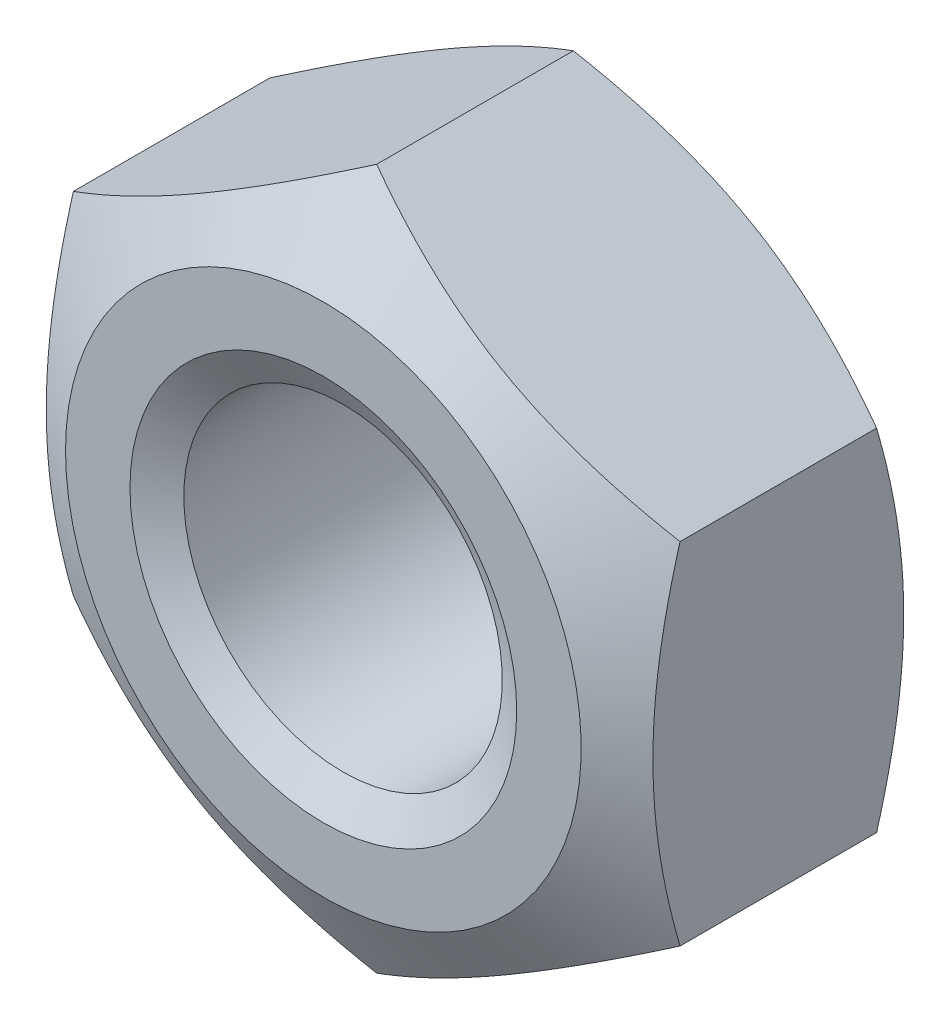
ISO-10303-21;
HEADER;
FILE_DESCRIPTION(('STEP AP214'),'2;1');
FILE_NAME('part.step','',(''),(''),'','','');
FILE_SCHEMA(('AUTOMOTIVE_DESIGN { 1 0 10303 214 1 1 1 1 }'));
ENDSEC;
DATA;
#1=APPLICATION_CONTEXT('core data for automotive mechanical design processes');
#2=APPLICATION_PROTOCOL_DEFINITION('international standard','automotive_design',2000,#1);
#3=PRODUCT_CONTEXT('',#1,'mechanical');
#4=PRODUCT('Part','Part','',(#3));
#5=PRODUCT_RELATED_PRODUCT_CATEGORY('part','',(#4));
#6=PRODUCT_DEFINITION_FORMATION('','',#4);
#7=PRODUCT_DEFINITION_CONTEXT('part definition',#1,'design');
#8=PRODUCT_DEFINITION('design','',#6,#7);
#9=PRODUCT_DEFINITION_SHAPE('','',#8);
#10=(LENGTH_UNIT() NAMED_UNIT(*) SI_UNIT(.MILLI.,.METRE.));
#11=(NAMED_UNIT(*) PLANE_ANGLE_UNIT() SI_UNIT($,.RADIAN.));
#12=(NAMED_UNIT(*) SI_UNIT($,.STERADIAN.) SOLID_ANGLE_UNIT());
#13=UNCERTAINTY_MEASURE_WITH_UNIT(LENGTH_MEASURE(1.E-05),#10,'distance_accuracy_value','');
#14=(GEOMETRIC_REPRESENTATION_CONTEXT(3) GLOBAL_UNCERTAINTY_ASSIGNED_CONTEXT((#13)) GLOBAL_UNIT_ASSIGNED_CONTEXT((#10,
#11,#12)) REPRESENTATION_CONTEXT('',''));
#15=CARTESIAN_POINT('',(0.,0.,0.));
#16=DIRECTION('',(0.,0.,1.));
#17=DIRECTION('',(1.,0.,0.));
#18=AXIS2_PLACEMENT_3D('',#15,#16,#17);
#19=CARTESIAN_POINT('',(0.,0.,-4.));
#20=DIRECTION('',(0.,0.,1.));
#21=DIRECTION('',(1.,0.,0.));
#22=AXIS2_PLACEMENT_3D('',#19,#20,#21);
#23=PLANE('',#22);
#24=CARTESIAN_POINT('',(0.,0.,-4.));
#25=DIRECTION('',(0.,0.,1.));
#26=DIRECTION('',(0.,-1.,0.));
#27=AXIS2_PLACEMENT_3D('',#24,#25,#26);
#28=CIRCLE('',#27,2.55);
#29=CARTESIAN_POINT('',(0.,2.55,-4.));
#30=VERTEX_POINT('',#29);
#31=EDGE_CURVE('E477',#30,#30,#28,.T.);
#32=ORIENTED_EDGE('',*,*,#31,.T.);
#33=EDGE_LOOP('',(#32));
#34=FACE_BOUND('',#33,.T.);
#35=CARTESIAN_POINT('',(0.,0.,-4.));
#36=DIRECTION('',(0.,0.,1.));
#37=DIRECTION('',(1.,0.,0.));
#38=AXIS2_PLACEMENT_3D('',#35,#36,#37);
#39=CIRCLE('',#38,3.4);
#40=CARTESIAN_POINT('',(-3.4,0.,-4.));
#41=VERTEX_POINT('',#40);
#42=EDGE_CURVE('E148',#41,#41,#39,.T.);
#43=ORIENTED_EDGE('',*,*,#42,.F.);
#44=EDGE_LOOP('',(#43));
#45=FACE_BOUND('',#44,.T.);
#46=ADVANCED_FACE('F16',(#34,#45),#23,.F.);
#47=CARTESIAN_POINT('',(0.,4.61880215351701,-4.));
#48=DIRECTION('',(-0.5,0.866025403784442,0.));
#49=DIRECTION('',(0.,0.,1.));
#50=AXIS2_PLACEMENT_3D('',#47,#48,#49);
#51=PLANE('',#50);
#52=DIRECTION('',(0.,0.,1.));
#53=VECTOR('',#52,1.);
#54=CARTESIAN_POINT('',(0.,4.61880215351701,-4.));
#55=LINE('',#54,#53);
#56=CARTESIAN_POINT('',(0.,4.61880215351701,-3.29632424857807));
#57=VERTEX_POINT('',#56);
#58=CARTESIAN_POINT('',(0.,4.61880215351701,-0.703675751421931));
#59=VERTEX_POINT('',#58);
#60=EDGE_CURVE('E45',#57,#59,#55,.T.);
#61=ORIENTED_EDGE('',*,*,#60,.F.);
#62=CARTESIAN_POINT('',(0.,4.61880215351701,-3.29632424857807));
#63=CARTESIAN_POINT('',(-1.06950282266503,4.00132441095229,-3.6528251894679));
#64=CARTESIAN_POINT('',(-1.99618002117847,3.46630708093867,-3.65358843434788));
#65=CARTESIAN_POINT('',(-2.49214524011956,3.17996142827434,-3.6539969292527));
#66=CARTESIAN_POINT('',(-3.00965541229661,2.88117679105955,-3.55749682863757));
#67=CARTESIAN_POINT('',(-3.47908683348415,2.61015043367086,-3.46996197075075));
#68=CARTESIAN_POINT('',(-4.,2.30940107675851,-3.29632424857806));
#69=B_SPLINE_CURVE_WITH_KNOTS('',2,(#62,#63,#64,#65,#66,#67,#68),.UNSPECIFIED.,.F.,.F.,(3,2,2,
3),(0.,0.5,0.75,1.),.UNSPECIFIED.);
#70=CARTESIAN_POINT('',(-4.,2.30940107675854,-3.29632424857807));
#71=VERTEX_POINT('',#70);
#72=EDGE_CURVE('E347',#57,#71,#69,.T.);
#73=ORIENTED_EDGE('',*,*,#72,.T.);
#74=DIRECTION('',(0.,0.,1.));
#75=VECTOR('',#74,1.);
#76=CARTESIAN_POINT('',(-4.,2.30940107675854,-4.));
#77=LINE('',#76,#75);
#78=CARTESIAN_POINT('',(-4.,2.30940107675854,-0.703675751421939));
#79=VERTEX_POINT('',#78);
#80=EDGE_CURVE('E11',#71,#79,#77,.T.);
#81=ORIENTED_EDGE('',*,*,#80,.T.);
#82=CARTESIAN_POINT('',(-4.,2.30940107675851,-0.70367575142194));
#83=CARTESIAN_POINT('',(-2.93049717733633,2.92687881932245,-0.34717481053256));
#84=CARTESIAN_POINT('',(-2.00381997882154,3.46189614933685,-0.346411565652125));
#85=CARTESIAN_POINT('',(-1.50785475988115,3.74824180200077,-0.346003070747065));
#86=CARTESIAN_POINT('',(-0.990344587703388,4.04702643921597,-0.44250317136243));
#87=CARTESIAN_POINT('',(-0.520913166515201,4.31805279660504,-0.53003802924946));
#88=CARTESIAN_POINT('',(0.,4.61880215351701,-0.70367575142193));
#89=B_SPLINE_CURVE_WITH_KNOTS('',2,(#82,#83,#84,#85,#86,#87,#88),.UNSPECIFIED.,.F.,.F.,(3,2,2,
3),(0.,0.5,0.75,1.),.UNSPECIFIED.);
#90=EDGE_CURVE('E433',#79,#59,#89,.T.);
#91=ORIENTED_EDGE('',*,*,#90,.T.);
#92=EDGE_LOOP('',(#61,#73,#81,#91));
#93=FACE_BOUND('',#92,.T.);
#94=ADVANCED_FACE('F326',(#93),#51,.T.);
#95=CARTESIAN_POINT('',(-4.,2.30940107675854,-4.));
#96=DIRECTION('',(-1.,0.,0.));
#97=DIRECTION('',(0.,0.,1.));
#98=AXIS2_PLACEMENT_3D('',#95,#96,#97);
#99=PLANE('',#98);
#100=ORIENTED_EDGE('',*,*,#80,.F.);
#101=CARTESIAN_POINT('',(-4.,2.30940107675854,-3.29632424857806));
#102=CARTESIAN_POINT('',(-4.,1.71172832431863,-3.46885751083232));
#103=CARTESIAN_POINT('',(-4.,1.1718228030086,-3.55652956562431));
#104=CARTESIAN_POINT('',(-4.00000000000001,0.57410238522735,-3.65358983848623));
#105=CARTESIAN_POINT('',(-4.00000000000001,0.,-3.65358983848623));
#106=B_SPLINE_CURVE_WITH_KNOTS('',2,(#101,#102,#103,#104,#105),.UNSPECIFIED.,.F.,.F.,(3,2,3),
(0.,0.5,1.),.UNSPECIFIED.);
#107=CARTESIAN_POINT('',(-4.,0.,-3.65358983848623));
#108=VERTEX_POINT('',#107);
#109=EDGE_CURVE('E344',#71,#108,#106,.T.);
#110=ORIENTED_EDGE('',*,*,#109,.T.);
#111=CARTESIAN_POINT('',(-4.00000000000001,0.,-3.65358983848623));
#112=CARTESIAN_POINT('',(-4.00000000000001,-0.56970523339298,-3.65358983848623));
#113=CARTESIAN_POINT('',(-4.00000000000001,-1.16354834781367,-3.55786827404048));
#114=CARTESIAN_POINT('',(-4.00000000000001,-1.70663251960036,-3.47032854294525));
#115=CARTESIAN_POINT('',(-4.00000000000001,-2.30940107675849,-3.29632424857807));
#116=B_SPLINE_CURVE_WITH_KNOTS('',2,(#111,#112,#113,#114,#115),.UNSPECIFIED.,.F.,.F.,(3,2,3),
(0.,0.5,1.),.UNSPECIFIED.);
#117=CARTESIAN_POINT('',(-4.,-2.30940107675849,-3.29632424857807));
#118=VERTEX_POINT('',#117);
#119=EDGE_CURVE('E349',#108,#118,#116,.T.);
#120=ORIENTED_EDGE('',*,*,#119,.T.);
#121=DIRECTION('',(0.,0.,1.));
#122=VECTOR('',#121,1.);
#123=CARTESIAN_POINT('',(-4.,-2.30940107675849,-4.));
#124=LINE('',#123,#122);
#125=CARTESIAN_POINT('',(-4.,-2.30940107675852,-0.703675751421939));
#126=VERTEX_POINT('',#125);
#127=EDGE_CURVE('E30',#118,#126,#124,.T.);
#128=ORIENTED_EDGE('',*,*,#127,.T.);
#129=CARTESIAN_POINT('',(-4.00000000000001,-2.30940107675852,-0.70367575142194));
#130=CARTESIAN_POINT('',(-4.00000000000001,-1.70722660919391,-0.529842955948135));
#131=CARTESIAN_POINT('',(-4.00000000000001,-1.16354834781368,-0.44213172595952));
#132=CARTESIAN_POINT('',(-4.00000000000001,-0.57021800982598,-0.34641016151377));
#133=CARTESIAN_POINT('',(-4.00000000000001,0.,-0.34641016151377));
#134=B_SPLINE_CURVE_WITH_KNOTS('',2,(#129,#130,#131,#132,#133),.UNSPECIFIED.,.F.,.F.,(3,2,3),
(0.,0.5,1.),.UNSPECIFIED.);
#135=CARTESIAN_POINT('',(-4.,0.,-0.346410161513772));
#136=VERTEX_POINT('',#135);
#137=EDGE_CURVE('E391',#126,#136,#134,.T.);
#138=ORIENTED_EDGE('',*,*,#137,.T.);
#139=CARTESIAN_POINT('',(-4.00000000000001,0.,-0.34641016151377));
#140=CARTESIAN_POINT('',(-4.00000000000001,0.573589654089425,-0.34641016151377));
#141=CARTESIAN_POINT('',(-4.,1.1718228030086,-0.443470434375695));
#142=CARTESIAN_POINT('',(-4.,1.71113399188109,-0.53097092017128));
#143=CARTESIAN_POINT('',(-4.,2.30940107675854,-0.70367575142194));
#144=B_SPLINE_CURVE_WITH_KNOTS('',2,(#139,#140,#141,#142,#143),.UNSPECIFIED.,.F.,.F.,(3,2,3),
(0.,0.5,1.),.UNSPECIFIED.);
#145=EDGE_CURVE('E314',#136,#79,#144,.T.);
#146=ORIENTED_EDGE('',*,*,#145,.T.);
#147=EDGE_LOOP('',(#100,#110,#120,#128,#138,#146));
#148=FACE_BOUND('',#147,.T.);
#149=ADVANCED_FACE('F318',(#148),#99,.T.);
#150=CARTESIAN_POINT('',(-4.,-2.30940107675849,-4.));
#151=DIRECTION('',(-0.5,-0.866025403784437,0.));
#152=DIRECTION('',(-0.866025403784437,0.5,0.));
#153=AXIS2_PLACEMENT_3D('',#150,#151,#152);
#154=PLANE('',#153);
#155=ORIENTED_EDGE('',*,*,#127,.F.);
#156=CARTESIAN_POINT('',(-4.,-2.30940107675849,-3.29632424857807));
#157=CARTESIAN_POINT('',(-2.93049717733497,-2.92687881932321,-3.65282518946791));
#158=CARTESIAN_POINT('',(-2.00381997882154,-3.46189614933683,-3.65358843434789));
#159=CARTESIAN_POINT('',(-1.50785475987994,-3.74824180200146,-3.6539969292527));
#160=CARTESIAN_POINT('',(-0.990344587703395,-4.04702643921595,-3.55749682863758));
#161=CARTESIAN_POINT('',(-0.520913166515319,-4.31805279660496,-3.46996197075058));
#162=CARTESIAN_POINT('',(0.,-4.61880215351699,-3.29632424857807));
#163=B_SPLINE_CURVE_WITH_KNOTS('',2,(#156,#157,#158,#159,#160,#161,#162),.UNSPECIFIED.,.F.,.F.,
(3,2,2,3),(0.,0.5,0.75,1.),.UNSPECIFIED.);
#164=CARTESIAN_POINT('',(0.,-4.61880215351701,-3.29632424857807));
#165=VERTEX_POINT('',#164);
#166=EDGE_CURVE('E356',#118,#165,#163,.T.);
#167=ORIENTED_EDGE('',*,*,#166,.T.);
#168=DIRECTION('',(0.,0.,1.));
#169=VECTOR('',#168,1.);
#170=CARTESIAN_POINT('',(0.,-4.61880215351701,-4.));
#171=LINE('',#170,#169);
#172=CARTESIAN_POINT('',(0.,-4.61880215351702,-0.703675751421939));
#173=VERTEX_POINT('',#172);
#174=EDGE_CURVE('E256',#165,#173,#171,.T.);
#175=ORIENTED_EDGE('',*,*,#174,.T.);
#176=CARTESIAN_POINT('',(0.,-4.61880215351701,-0.70367575142195));
#177=CARTESIAN_POINT('',(-1.06950282266367,-4.00132441095306,-0.347174810532561));
#178=CARTESIAN_POINT('',(-1.99618002117845,-3.46630708093866,-0.346411565652131));
#179=CARTESIAN_POINT('',(-2.49214524011971,-3.17996142827424,-0.346003070747066));
#180=CARTESIAN_POINT('',(-3.0096554122966,-2.88117679105954,-0.442503171362431));
#181=CARTESIAN_POINT('',(-3.47908683348584,-2.61015043366986,-0.530038029249805));
#182=CARTESIAN_POINT('',(-3.99999999999999,-2.3094010767585,-0.70367575142195));
#183=B_SPLINE_CURVE_WITH_KNOTS('',2,(#176,#177,#178,#179,#180,#181,#182),.UNSPECIFIED.,.F.,.F.,
(3,2,2,3),(0.,0.5,0.75,1.),.UNSPECIFIED.);
#184=EDGE_CURVE('E387',#173,#126,#183,.T.);
#185=ORIENTED_EDGE('',*,*,#184,.T.);
#186=EDGE_LOOP('',(#155,#167,#175,#185));
#187=FACE_BOUND('',#186,.T.);
#188=ADVANCED_FACE('F229',(#187),#154,.T.);
#189=CARTESIAN_POINT('',(0.,-4.61880215351701,-4.));
#190=DIRECTION('',(0.5,-0.866025403784441,0.));
#191=DIRECTION('',(0.,0.,-1.));
#192=AXIS2_PLACEMENT_3D('',#189,#190,#191);
#193=PLANE('',#192);
#194=ORIENTED_EDGE('',*,*,#174,.F.);
#195=CARTESIAN_POINT('',(0.,-4.61880215351701,-3.29632424857807));
#196=CARTESIAN_POINT('',(1.06950282266502,-4.00132441095229,-3.65282518946791));
#197=CARTESIAN_POINT('',(1.99618002117845,-3.46630708093867,-3.65358843434789));
#198=CARTESIAN_POINT('',(2.49214524011934,-3.17996142827446,-3.65399692925271));
#199=CARTESIAN_POINT('',(3.0096554122966,-2.88117679105954,-3.55749682863758));
#200=CARTESIAN_POINT('',(3.47908683348389,-2.610150433671,-3.46996197075085));
#201=CARTESIAN_POINT('',(3.99999999999999,-2.3094010767585,-3.29632424857807));
#202=B_SPLINE_CURVE_WITH_KNOTS('',2,(#195,#196,#197,#198,#199,#200,#201),.UNSPECIFIED.,.F.,.F.,
(3,2,2,3),(0.,0.5,0.75,1.),.UNSPECIFIED.);
#203=CARTESIAN_POINT('',(4.,-2.30940107675852,-3.29632424857807));
#204=VERTEX_POINT('',#203);
#205=EDGE_CURVE('E138',#165,#204,#202,.T.);
#206=ORIENTED_EDGE('',*,*,#205,.T.);
#207=DIRECTION('',(0.,0.,1.));
#208=VECTOR('',#207,1.);
#209=CARTESIAN_POINT('',(4.,-2.30940107675853,-4.));
#210=LINE('',#209,#208);
#211=CARTESIAN_POINT('',(4.,-2.30940107675851,-0.703675751421939));
#212=VERTEX_POINT('',#211);
#213=EDGE_CURVE('E132',#204,#212,#210,.T.);
#214=ORIENTED_EDGE('',*,*,#213,.T.);
#215=CARTESIAN_POINT('',(4.00000000000002,-2.30940107675849,-0.70367575142194));
#216=CARTESIAN_POINT('',(2.93049717733633,-2.92687881932243,-0.34717481053255));
#217=CARTESIAN_POINT('',(2.00381997882154,-3.46189614933683,-0.346411565652115));
#218=CARTESIAN_POINT('',(1.50785475988138,-3.74824180200063,-0.346003070747055));
#219=CARTESIAN_POINT('',(0.990344587703386,-4.04702643921596,-0.44250317136242));
#220=CARTESIAN_POINT('',(0.520913166515411,-4.31805279660491,-0.530038029249375));
#221=CARTESIAN_POINT('',(0.,-4.618802153517,-0.70367575142194));
#222=B_SPLINE_CURVE_WITH_KNOTS('',2,(#215,#216,#217,#218,#219,#220,#221),.UNSPECIFIED.,.F.,.F.,
(3,2,2,3),(0.,0.5,0.75,1.),.UNSPECIFIED.);
#223=EDGE_CURVE('E252',#212,#173,#222,.T.);
#224=ORIENTED_EDGE('',*,*,#223,.T.);
#225=EDGE_LOOP('',(#194,#206,#214,#224));
#226=FACE_BOUND('',#225,.T.);
#227=ADVANCED_FACE('F219',(#226),#193,.T.);
#228=CARTESIAN_POINT('',(4.,-2.30940107675853,-4.));
#229=DIRECTION('',(1.,0.,0.));
#230=DIRECTION('',(0.,-1.,0.));
#231=AXIS2_PLACEMENT_3D('',#228,#229,#230);
#232=PLANE('',#231);
#233=ORIENTED_EDGE('',*,*,#213,.F.);
#234=CARTESIAN_POINT('',(4.,-2.30940107675852,-3.29632424857807));
#235=CARTESIAN_POINT('',(4.,-1.70722660919381,-3.47015704405191));
#236=CARTESIAN_POINT('',(4.,-1.16354834781385,-3.55786827404047));
#237=CARTESIAN_POINT('',(4.00000000000001,-0.570218009825885,-3.65358983848624));
#238=CARTESIAN_POINT('',(4.00000000000001,0.,-3.65358983848624));
#239=B_SPLINE_CURVE_WITH_KNOTS('',2,(#234,#235,#236,#237,#238),.UNSPECIFIED.,.F.,.F.,(3,2,3),
(0.,0.5,1.),.UNSPECIFIED.);
#240=CARTESIAN_POINT('',(4.,0.,-3.65358983848624));
#241=VERTEX_POINT('',#240);
#242=EDGE_CURVE('E126',#204,#241,#239,.T.);
#243=ORIENTED_EDGE('',*,*,#242,.T.);
#244=CARTESIAN_POINT('',(4.00000000000001,0.,-3.65358983848624));
#245=CARTESIAN_POINT('',(4.00000000000001,0.573589654088265,-3.65358983848624));
#246=CARTESIAN_POINT('',(4.00000000000001,1.17182280300877,-3.55652956562428));
#247=CARTESIAN_POINT('',(4.00000000000001,1.71113399187974,-3.46902907982911));
#248=CARTESIAN_POINT('',(4.00000000000001,2.30940107675851,-3.29632424857807));
#249=B_SPLINE_CURVE_WITH_KNOTS('',2,(#244,#245,#246,#247,#248),.UNSPECIFIED.,.F.,.F.,(3,2,3),
(0.,0.5,1.),.UNSPECIFIED.);
#250=CARTESIAN_POINT('',(4.,2.30940107675852,-3.29632424857807));
#251=VERTEX_POINT('',#250);
#252=EDGE_CURVE('E129',#241,#251,#249,.T.);
#253=ORIENTED_EDGE('',*,*,#252,.T.);
#254=DIRECTION('',(0.,0.,1.));
#255=VECTOR('',#254,1.);
#256=CARTESIAN_POINT('',(4.,2.3094010767585,-4.));
#257=LINE('',#256,#255);
#258=CARTESIAN_POINT('',(4.,2.30940107675855,-0.703675751421939));
#259=VERTEX_POINT('',#258);
#260=EDGE_CURVE('E435',#251,#259,#257,.T.);
#261=ORIENTED_EDGE('',*,*,#260,.T.);
#262=CARTESIAN_POINT('',(4.00000000000001,2.30940107675855,-0.70367575142194));
#263=CARTESIAN_POINT('',(4.00000000000001,1.71172832431849,-0.531142489167641));
#264=CARTESIAN_POINT('',(4.00000000000001,1.17182280300878,-0.44347043437572));
#265=CARTESIAN_POINT('',(4.00000000000001,0.574102385227199,-0.346410161513765));
#266=CARTESIAN_POINT('',(4.00000000000001,0.,-0.346410161513765));
#267=B_SPLINE_CURVE_WITH_KNOTS('',2,(#262,#263,#264,#265,#266),.UNSPECIFIED.,.F.,.F.,(3,2,3),
(0.,0.5,1.),.UNSPECIFIED.);
#268=CARTESIAN_POINT('',(4.,0.,-0.346410161513764));
#269=VERTEX_POINT('',#268);
#270=EDGE_CURVE('E772',#259,#269,#267,.T.);
#271=ORIENTED_EDGE('',*,*,#270,.T.);
#272=CARTESIAN_POINT('',(4.00000000000001,0.,-0.346410161513765));
#273=CARTESIAN_POINT('',(4.00000000000001,-0.569705233392765,-0.346410161513765));
#274=CARTESIAN_POINT('',(4.,-1.16354834781384,-0.442131725959535));
#275=CARTESIAN_POINT('',(4.,-1.70663251960019,-0.52967145705468));
#276=CARTESIAN_POINT('',(4.,-2.3094010767585,-0.70367575142194));
#277=B_SPLINE_CURVE_WITH_KNOTS('',2,(#272,#273,#274,#275,#276),.UNSPECIFIED.,.F.,.F.,(3,2,3),
(0.,0.5,1.),.UNSPECIFIED.);
#278=EDGE_CURVE('E389',#269,#212,#277,.T.);
#279=ORIENTED_EDGE('',*,*,#278,.T.);
#280=EDGE_LOOP('',(#233,#243,#253,#261,#271,#279));
#281=FACE_BOUND('',#280,.T.);
#282=ADVANCED_FACE('F18',(#281),#232,.T.);
#283=CARTESIAN_POINT('',(4.,2.3094010767585,-4.));
#284=DIRECTION('',(0.5,0.866025403784438,0.));
#285=DIRECTION('',(0.,0.,-1.));
#286=AXIS2_PLACEMENT_3D('',#283,#284,#285);
#287=PLANE('',#286);
#288=ORIENTED_EDGE('',*,*,#260,.F.);
#289=CARTESIAN_POINT('',(3.99999999999999,2.3094010767585,-3.29632424857807));
#290=CARTESIAN_POINT('',(2.93049717733362,2.926878819324,-3.65282518946836));
#291=CARTESIAN_POINT('',(2.00381997882153,3.46189614933684,-3.65358843434789));
#292=CARTESIAN_POINT('',(1.50785475987892,3.74824180200205,-3.65399692925246));
#293=CARTESIAN_POINT('',(0.990344587703387,4.04702643921597,-3.55749682863758));
#294=CARTESIAN_POINT('',(0.520913166515622,4.31805279660479,-3.46996197075068));
#295=CARTESIAN_POINT('',(0.,4.618802153517,-3.29632424857807));
#296=B_SPLINE_CURVE_WITH_KNOTS('',2,(#289,#290,#291,#292,#293,#294,#295),.UNSPECIFIED.,.F.,.F.,
(3,2,2,3),(0.,0.5,0.75,1.),.UNSPECIFIED.);
#297=EDGE_CURVE('E145',#251,#57,#296,.T.);
#298=ORIENTED_EDGE('',*,*,#297,.T.);
#299=ORIENTED_EDGE('',*,*,#60,.T.);
#300=CARTESIAN_POINT('',(0.,4.618802153517,-0.70367575142193));
#301=CARTESIAN_POINT('',(1.06950282266367,4.00132441095307,-0.34717481053255));
#302=CARTESIAN_POINT('',(1.99618002117846,3.46630708093867,-0.346411565652115));
#303=CARTESIAN_POINT('',(2.49214524012044,3.17996142827382,-0.34600307074705));
#304=CARTESIAN_POINT('',(3.0096554122966,2.88117679105955,-0.44250317136242));
#305=CARTESIAN_POINT('',(3.47908683348672,2.61015043366936,-0.530038029250085));
#306=CARTESIAN_POINT('',(3.99999999999998,2.30940107675851,-0.70367575142194));
#307=B_SPLINE_CURVE_WITH_KNOTS('',2,(#300,#301,#302,#303,#304,#305,#306),.UNSPECIFIED.,.F.,.F.,
(3,2,2,3),(0.,0.5,0.75,1.),.UNSPECIFIED.);
#308=EDGE_CURVE('E765',#59,#259,#307,.T.);
#309=ORIENTED_EDGE('',*,*,#308,.T.);
#310=EDGE_LOOP('',(#288,#298,#299,#309));
#311=FACE_BOUND('',#310,.T.);
#312=ADVANCED_FACE('F171',(#311),#287,.T.);
#313=CARTESIAN_POINT('',(0.,0.,0.));
#314=DIRECTION('',(0.,0.,1.));
#315=DIRECTION('',(1.,0.,0.));
#316=AXIS2_PLACEMENT_3D('',#313,#314,#315);
#317=PLANE('',#316);
#318=CARTESIAN_POINT('',(0.,0.,0.));
#319=DIRECTION('',(0.,0.,1.));
#320=DIRECTION('',(0.,-1.,0.));
#321=AXIS2_PLACEMENT_3D('',#318,#319,#320);
#322=CIRCLE('',#321,2.55);
#323=CARTESIAN_POINT('',(0.,-2.55,0.));
#324=VERTEX_POINT('',#323);
#325=EDGE_CURVE('E89',#324,#324,#322,.T.);
#326=ORIENTED_EDGE('',*,*,#325,.F.);
#327=EDGE_LOOP('',(#326));
#328=FACE_BOUND('',#327,.T.);
#329=CARTESIAN_POINT('',(0.,0.,0.));
#330=DIRECTION('',(0.,0.,1.));
#331=DIRECTION('',(1.,0.,0.));
#332=AXIS2_PLACEMENT_3D('',#329,#330,#331);
#333=CIRCLE('',#332,3.4);
#334=CARTESIAN_POINT('',(-3.4,0.,0.));
#335=VERTEX_POINT('',#334);
#336=EDGE_CURVE('E439',#335,#335,#333,.T.);
#337=ORIENTED_EDGE('',*,*,#336,.T.);
#338=EDGE_LOOP('',(#337));
#339=FACE_BOUND('',#338,.T.);
#340=ADVANCED_FACE('F231',(#328,#339),#317,.T.);
#341=CARTESIAN_POINT('',(0.,0.,0.));
#342=DIRECTION('',(0.,0.,-1.));
#343=DIRECTION('',(-1.,0.,0.));
#344=AXIS2_PLACEMENT_3D('',#341,#342,#343);
#345=CONICAL_SURFACE('',#344,3.4,1.0471975511966);
#346=ORIENTED_EDGE('',*,*,#145,.F.);
#347=ORIENTED_EDGE('',*,*,#137,.F.);
#348=ORIENTED_EDGE('',*,*,#184,.F.);
#349=ORIENTED_EDGE('',*,*,#223,.F.);
#350=ORIENTED_EDGE('',*,*,#278,.F.);
#351=ORIENTED_EDGE('',*,*,#270,.F.);
#352=ORIENTED_EDGE('',*,*,#308,.F.);
#353=ORIENTED_EDGE('',*,*,#90,.F.);
#354=EDGE_LOOP('',(#346,#347,#348,#349,#350,#351,#352,#353));
#355=FACE_BOUND('',#354,.T.);
#356=ORIENTED_EDGE('',*,*,#336,.F.);
#357=EDGE_LOOP('',(#356));
#358=FACE_BOUND('',#357,.T.);
#359=ADVANCED_FACE('F170',(#355,#358),#345,.T.);
#360=CARTESIAN_POINT('',(0.,0.,-3.29632424857807));
#361=DIRECTION('',(0.,0.,1.));
#362=DIRECTION('',(1.,0.,0.));
#363=AXIS2_PLACEMENT_3D('',#360,#361,#362);
#364=CONICAL_SURFACE('',#363,4.61880215351701,1.0471975511966);
#365=ORIENTED_EDGE('',*,*,#252,.F.);
#366=ORIENTED_EDGE('',*,*,#242,.F.);
#367=ORIENTED_EDGE('',*,*,#205,.F.);
#368=ORIENTED_EDGE('',*,*,#166,.F.);
#369=ORIENTED_EDGE('',*,*,#119,.F.);
#370=ORIENTED_EDGE('',*,*,#109,.F.);
#371=ORIENTED_EDGE('',*,*,#72,.F.);
#372=ORIENTED_EDGE('',*,*,#297,.F.);
#373=EDGE_LOOP('',(#365,#366,#367,#368,#369,#370,#371,#372));
#374=FACE_BOUND('',#373,.T.);
#375=ORIENTED_EDGE('',*,*,#42,.T.);
#376=EDGE_LOOP('',(#375));
#377=FACE_BOUND('',#376,.T.);
#378=ADVANCED_FACE('F142',(#374,#377),#364,.T.);
#379=CARTESIAN_POINT('',(0.,0.,-0.259807621135335));
#380=DIRECTION('',(0.,0.,1.));
#381=DIRECTION('',(0.,-1.,0.));
#382=AXIS2_PLACEMENT_3D('',#379,#380,#381);
#383=CONICAL_SURFACE('',#382,2.1,1.0471975511966);
#384=ORIENTED_EDGE('',*,*,#325,.T.);
#385=EDGE_LOOP('',(#384));
#386=FACE_BOUND('',#385,.T.);
#387=CARTESIAN_POINT('',(0.,0.,-0.259807621135335));
#388=DIRECTION('',(0.,0.,1.));
#389=DIRECTION('',(0.,-1.,0.));
#390=AXIS2_PLACEMENT_3D('',#387,#388,#389);
#391=CIRCLE('',#390,2.1);
#392=CARTESIAN_POINT('',(0.,-2.1,-0.259807621135335));
#393=VERTEX_POINT('',#392);
#394=EDGE_CURVE('E78',#393,#393,#391,.T.);
#395=ORIENTED_EDGE('',*,*,#394,.F.);
#396=EDGE_LOOP('',(#395));
#397=FACE_BOUND('',#396,.T.);
#398=ADVANCED_FACE('F169',(#386,#397),#383,.F.);
#399=CARTESIAN_POINT('',(0.,0.,0.));
#400=DIRECTION('',(0.,0.,1.));
#401=DIRECTION('',(0.,-1.,0.));
#402=AXIS2_PLACEMENT_3D('',#399,#400,#401);
#403=CYLINDRICAL_SURFACE('',#402,2.1);
#404=ORIENTED_EDGE('',*,*,#394,.T.);
#405=EDGE_LOOP('',(#404));
#406=FACE_BOUND('',#405,.T.);
#407=CARTESIAN_POINT('',(0.,0.,-3.74019237886467));
#408=DIRECTION('',(0.,0.,1.));
#409=DIRECTION('',(0.,-1.,0.));
#410=AXIS2_PLACEMENT_3D('',#407,#408,#409);
#411=CIRCLE('',#410,2.1);
#412=CARTESIAN_POINT('',(0.,-2.1,-3.74019237886467));
#413=VERTEX_POINT('',#412);
#414=EDGE_CURVE('E481',#413,#413,#411,.T.);
#415=ORIENTED_EDGE('',*,*,#414,.F.);
#416=EDGE_LOOP('',(#415));
#417=FACE_BOUND('',#416,.T.);
#418=ADVANCED_FACE('F405',(#406,#417),#403,.F.);
#419=CARTESIAN_POINT('',(0.,0.,-4.));
#420=DIRECTION('',(0.,0.,-1.));
#421=DIRECTION('',(0.,1.,0.));
#422=AXIS2_PLACEMENT_3D('',#419,#420,#421);
#423=CONICAL_SURFACE('',#422,2.55,1.04719755119659);
#424=ORIENTED_EDGE('',*,*,#31,.F.);
#425=EDGE_LOOP('',(#424));
#426=FACE_BOUND('',#425,.T.);
#427=ORIENTED_EDGE('',*,*,#414,.T.);
#428=EDGE_LOOP('',(#427));
#429=FACE_BOUND('',#428,.T.);
#430=ADVANCED_FACE('F233',(#426,#429),#423,.F.);
#431=CLOSED_SHELL('',(#46,#94,#149,#188,#227,#282,#312,#340,#359,#378,#398,#418,#430));
#432=MANIFOLD_SOLID_BREP('B1',#431);
#433=ADVANCED_BREP_SHAPE_REPRESENTATION('',(#18,#432),#14);
#434=SHAPE_DEFINITION_REPRESENTATION(#9,#433);
ENDSEC;
END-ISO-10303-21;
